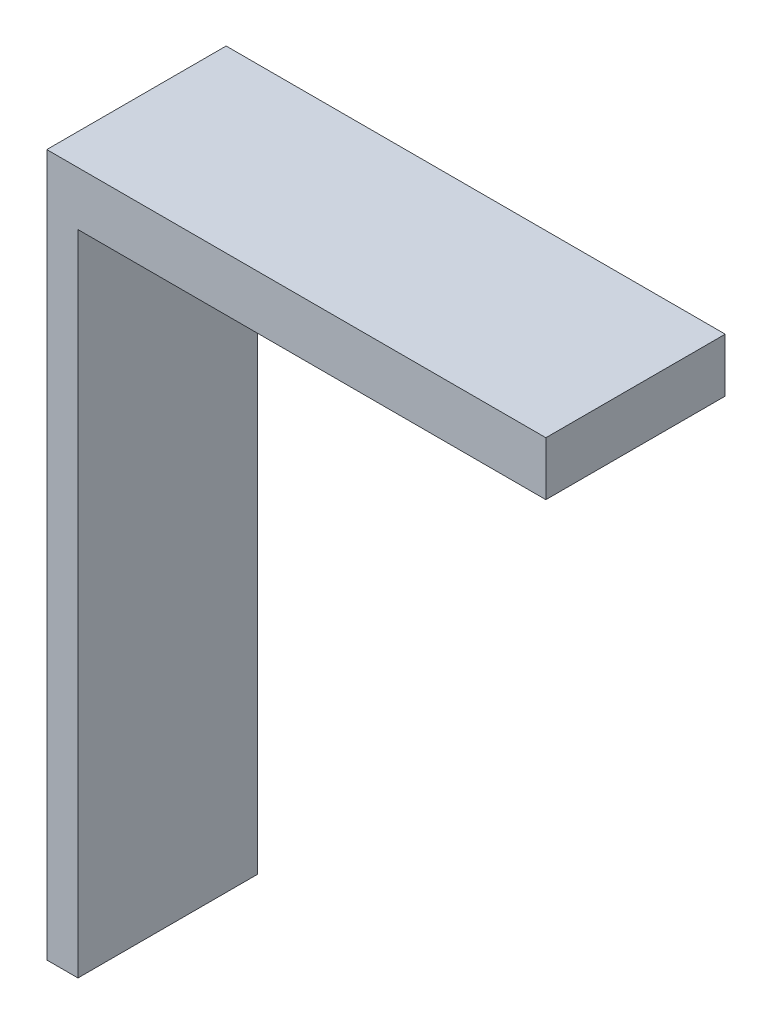
ISO-10303-21;
HEADER;
FILE_DESCRIPTION(('STEP AP214'),'2;1');
FILE_NAME('part.step','',(''),(''),'','','');
FILE_SCHEMA(('AUTOMOTIVE_DESIGN { 1 0 10303 214 1 1 1 1 }'));
ENDSEC;
DATA;
#1=APPLICATION_CONTEXT('core data for automotive mechanical design processes');
#2=APPLICATION_PROTOCOL_DEFINITION('international standard','automotive_design',2000,#1);
#3=PRODUCT_CONTEXT('',#1,'mechanical');
#4=PRODUCT('Part','Part','',(#3));
#5=PRODUCT_RELATED_PRODUCT_CATEGORY('part','',(#4));
#6=PRODUCT_DEFINITION_FORMATION('','',#4);
#7=PRODUCT_DEFINITION_CONTEXT('part definition',#1,'design');
#8=PRODUCT_DEFINITION('design','',#6,#7);
#9=PRODUCT_DEFINITION_SHAPE('','',#8);
#10=(LENGTH_UNIT() NAMED_UNIT(*) SI_UNIT(.MILLI.,.METRE.));
#11=(NAMED_UNIT(*) PLANE_ANGLE_UNIT() SI_UNIT($,.RADIAN.));
#12=(NAMED_UNIT(*) SI_UNIT($,.STERADIAN.) SOLID_ANGLE_UNIT());
#13=UNCERTAINTY_MEASURE_WITH_UNIT(LENGTH_MEASURE(1.E-05),#10,'distance_accuracy_value','');
#14=(GEOMETRIC_REPRESENTATION_CONTEXT(3) GLOBAL_UNCERTAINTY_ASSIGNED_CONTEXT((#13)) GLOBAL_UNIT_ASSIGNED_CONTEXT((#10,
#11,#12)) REPRESENTATION_CONTEXT('',''));
#15=CARTESIAN_POINT('',(0.,0.,0.));
#16=DIRECTION('',(0.,0.,1.));
#17=DIRECTION('',(1.,0.,0.));
#18=AXIS2_PLACEMENT_3D('',#15,#16,#17);
#19=CARTESIAN_POINT('',(2.,-45.,23.));
#20=DIRECTION('',(-1.,0.,0.));
#21=DIRECTION('',(0.,0.,1.));
#22=AXIS2_PLACEMENT_3D('',#19,#20,#21);
#23=PLANE('',#22);
#24=DIRECTION('',(0.,0.,-1.));
#25=VECTOR('',#24,1.);
#26=CARTESIAN_POINT('',(2.,38.1165491931324,23.));
#27=LINE('',#26,#25);
#28=CARTESIAN_POINT('',(2.,38.1165491931324,23.));
#29=VERTEX_POINT('',#28);
#30=CARTESIAN_POINT('',(2.,38.1165491931324,0.));
#31=VERTEX_POINT('',#30);
#32=EDGE_CURVE('E53',#29,#31,#27,.T.);
#33=ORIENTED_EDGE('',*,*,#32,.F.);
#34=DIRECTION('',(0.,1.,0.));
#35=VECTOR('',#34,1.);
#36=CARTESIAN_POINT('',(2.,-45.,23.));
#37=LINE('',#36,#35);
#38=CARTESIAN_POINT('',(2.,-45.,23.));
#39=VERTEX_POINT('',#38);
#40=EDGE_CURVE('E119',#39,#29,#37,.T.);
#41=ORIENTED_EDGE('',*,*,#40,.F.);
#42=DIRECTION('',(0.,0.,-1.));
#43=VECTOR('',#42,1.);
#44=CARTESIAN_POINT('',(2.,-45.,23.));
#45=LINE('',#44,#43);
#46=CARTESIAN_POINT('',(2.,-45.,0.));
#47=VERTEX_POINT('',#46);
#48=EDGE_CURVE('E131',#39,#47,#45,.T.);
#49=ORIENTED_EDGE('',*,*,#48,.T.);
#50=DIRECTION('',(0.,1.,0.));
#51=VECTOR('',#50,1.);
#52=CARTESIAN_POINT('',(2.,-45.,0.));
#53=LINE('',#52,#51);
#54=EDGE_CURVE('E120',#47,#31,#53,.T.);
#55=ORIENTED_EDGE('',*,*,#54,.T.);
#56=EDGE_LOOP('',(#33,#41,#49,#55));
#57=FACE_BOUND('',#56,.T.);
#58=ADVANCED_FACE('F39',(#57),#23,.F.);
#59=CARTESIAN_POINT('',(-2.,45.,23.));
#60=DIRECTION('',(0.,-1.,0.));
#61=DIRECTION('',(0.,0.,-1.));
#62=AXIS2_PLACEMENT_3D('',#59,#60,#61);
#63=PLANE('',#62);
#64=DIRECTION('',(-1.,0.,0.));
#65=VECTOR('',#64,1.);
#66=CARTESIAN_POINT('',(-2.,45.,0.));
#67=LINE('',#66,#65);
#68=CARTESIAN_POINT('',(62.,45.,0.));
#69=VERTEX_POINT('',#68);
#70=CARTESIAN_POINT('',(-2.,45.,0.));
#71=VERTEX_POINT('',#70);
#72=EDGE_CURVE('E122',#69,#71,#67,.T.);
#73=ORIENTED_EDGE('',*,*,#72,.T.);
#74=DIRECTION('',(0.,0.,-1.));
#75=VECTOR('',#74,1.);
#76=CARTESIAN_POINT('',(-2.,45.,23.));
#77=LINE('',#76,#75);
#78=CARTESIAN_POINT('',(-2.,45.,23.));
#79=VERTEX_POINT('',#78);
#80=EDGE_CURVE('E11',#79,#71,#77,.T.);
#81=ORIENTED_EDGE('',*,*,#80,.F.);
#82=DIRECTION('',(-1.,0.,0.));
#83=VECTOR('',#82,1.);
#84=CARTESIAN_POINT('',(-2.,45.,23.));
#85=LINE('',#84,#83);
#86=CARTESIAN_POINT('',(62.,45.,23.));
#87=VERTEX_POINT('',#86);
#88=EDGE_CURVE('E83',#87,#79,#85,.T.);
#89=ORIENTED_EDGE('',*,*,#88,.F.);
#90=DIRECTION('',(0.,0.,1.));
#91=VECTOR('',#90,1.);
#92=CARTESIAN_POINT('',(62.,45.,23.));
#93=LINE('',#92,#91);
#94=EDGE_CURVE('E116',#69,#87,#93,.T.);
#95=ORIENTED_EDGE('',*,*,#94,.F.);
#96=EDGE_LOOP('',(#73,#81,#89,#95));
#97=FACE_BOUND('',#96,.T.);
#98=ADVANCED_FACE('F148',(#97),#63,.F.);
#99=CARTESIAN_POINT('',(-2.,-45.,23.));
#100=DIRECTION('',(1.,0.,0.));
#101=DIRECTION('',(0.,0.,-1.));
#102=AXIS2_PLACEMENT_3D('',#99,#100,#101);
#103=PLANE('',#102);
#104=DIRECTION('',(0.,-1.,0.));
#105=VECTOR('',#104,1.);
#106=CARTESIAN_POINT('',(-2.,-45.,0.));
#107=LINE('',#106,#105);
#108=CARTESIAN_POINT('',(-2.,-45.,0.));
#109=VERTEX_POINT('',#108);
#110=EDGE_CURVE('E134',#71,#109,#107,.T.);
#111=ORIENTED_EDGE('',*,*,#110,.T.);
#112=DIRECTION('',(0.,0.,-1.));
#113=VECTOR('',#112,1.);
#114=CARTESIAN_POINT('',(-2.,-45.,23.));
#115=LINE('',#114,#113);
#116=CARTESIAN_POINT('',(-2.,-45.,23.));
#117=VERTEX_POINT('',#116);
#118=EDGE_CURVE('E46',#117,#109,#115,.T.);
#119=ORIENTED_EDGE('',*,*,#118,.F.);
#120=DIRECTION('',(0.,-1.,0.));
#121=VECTOR('',#120,1.);
#122=CARTESIAN_POINT('',(-2.,-45.,23.));
#123=LINE('',#122,#121);
#124=EDGE_CURVE('E129',#79,#117,#123,.T.);
#125=ORIENTED_EDGE('',*,*,#124,.F.);
#126=ORIENTED_EDGE('',*,*,#80,.T.);
#127=EDGE_LOOP('',(#111,#119,#125,#126));
#128=FACE_BOUND('',#127,.T.);
#129=ADVANCED_FACE('F149',(#128),#103,.F.);
#130=CARTESIAN_POINT('',(-2.,-45.,23.));
#131=DIRECTION('',(0.,1.,0.));
#132=DIRECTION('',(0.,0.,1.));
#133=AXIS2_PLACEMENT_3D('',#130,#131,#132);
#134=PLANE('',#133);
#135=DIRECTION('',(1.,0.,0.));
#136=VECTOR('',#135,1.);
#137=CARTESIAN_POINT('',(-2.,-45.,0.));
#138=LINE('',#137,#136);
#139=EDGE_CURVE('E78',#109,#47,#138,.T.);
#140=ORIENTED_EDGE('',*,*,#139,.T.);
#141=ORIENTED_EDGE('',*,*,#48,.F.);
#142=DIRECTION('',(1.,0.,0.));
#143=VECTOR('',#142,1.);
#144=CARTESIAN_POINT('',(-2.,-45.,23.));
#145=LINE('',#144,#143);
#146=EDGE_CURVE('E61',#117,#39,#145,.T.);
#147=ORIENTED_EDGE('',*,*,#146,.F.);
#148=ORIENTED_EDGE('',*,*,#118,.T.);
#149=EDGE_LOOP('',(#140,#141,#147,#148));
#150=FACE_BOUND('',#149,.T.);
#151=ADVANCED_FACE('F138',(#150),#134,.F.);
#152=CARTESIAN_POINT('',(0.,0.,23.));
#153=DIRECTION('',(0.,0.,-1.));
#154=DIRECTION('',(-1.,0.,0.));
#155=AXIS2_PLACEMENT_3D('',#152,#153,#154);
#156=PLANE('',#155);
#157=ORIENTED_EDGE('',*,*,#40,.T.);
#158=DIRECTION('',(-1.,0.,0.));
#159=VECTOR('',#158,1.);
#160=CARTESIAN_POINT('',(62.,38.1165491931324,23.));
#161=LINE('',#160,#159);
#162=CARTESIAN_POINT('',(62.,38.1165491931324,23.));
#163=VERTEX_POINT('',#162);
#164=EDGE_CURVE('E104',#163,#29,#161,.T.);
#165=ORIENTED_EDGE('',*,*,#164,.F.);
#166=DIRECTION('',(0.,-1.,0.));
#167=VECTOR('',#166,1.);
#168=CARTESIAN_POINT('',(62.,45.,23.));
#169=LINE('',#168,#167);
#170=EDGE_CURVE('E111',#87,#163,#169,.T.);
#171=ORIENTED_EDGE('',*,*,#170,.F.);
#172=ORIENTED_EDGE('',*,*,#88,.T.);
#173=ORIENTED_EDGE('',*,*,#124,.T.);
#174=ORIENTED_EDGE('',*,*,#146,.T.);
#175=EDGE_LOOP('',(#157,#165,#171,#172,#173,#174));
#176=FACE_BOUND('',#175,.T.);
#177=ADVANCED_FACE('F118',(#176),#156,.F.);
#178=CARTESIAN_POINT('',(0.,0.,0.));
#179=DIRECTION('',(0.,0.,-1.));
#180=DIRECTION('',(-1.,0.,0.));
#181=AXIS2_PLACEMENT_3D('',#178,#179,#180);
#182=PLANE('',#181);
#183=ORIENTED_EDGE('',*,*,#54,.F.);
#184=ORIENTED_EDGE('',*,*,#139,.F.);
#185=ORIENTED_EDGE('',*,*,#110,.F.);
#186=ORIENTED_EDGE('',*,*,#72,.F.);
#187=DIRECTION('',(0.,1.,0.));
#188=VECTOR('',#187,1.);
#189=CARTESIAN_POINT('',(62.,45.,0.));
#190=LINE('',#189,#188);
#191=CARTESIAN_POINT('',(62.,38.1165491931324,0.));
#192=VERTEX_POINT('',#191);
#193=EDGE_CURVE('E110',#192,#69,#190,.T.);
#194=ORIENTED_EDGE('',*,*,#193,.F.);
#195=DIRECTION('',(-1.,0.,0.));
#196=VECTOR('',#195,1.);
#197=CARTESIAN_POINT('',(62.,38.1165491931324,0.));
#198=LINE('',#197,#196);
#199=EDGE_CURVE('E106',#192,#31,#198,.T.);
#200=ORIENTED_EDGE('',*,*,#199,.T.);
#201=EDGE_LOOP('',(#183,#184,#185,#186,#194,#200));
#202=FACE_BOUND('',#201,.T.);
#203=ADVANCED_FACE('F144',(#202),#182,.T.);
#204=CARTESIAN_POINT('',(62.,38.1165491931324,23.));
#205=DIRECTION('',(0.,1.,0.));
#206=DIRECTION('',(0.,0.,1.));
#207=AXIS2_PLACEMENT_3D('',#204,#205,#206);
#208=PLANE('',#207);
#209=ORIENTED_EDGE('',*,*,#32,.T.);
#210=ORIENTED_EDGE('',*,*,#199,.F.);
#211=DIRECTION('',(0.,0.,-1.));
#212=VECTOR('',#211,1.);
#213=CARTESIAN_POINT('',(62.,38.1165491931324,23.));
#214=LINE('',#213,#212);
#215=EDGE_CURVE('E100',#163,#192,#214,.T.);
#216=ORIENTED_EDGE('',*,*,#215,.F.);
#217=ORIENTED_EDGE('',*,*,#164,.T.);
#218=EDGE_LOOP('',(#209,#210,#216,#217));
#219=FACE_BOUND('',#218,.T.);
#220=ADVANCED_FACE('F102',(#219),#208,.F.);
#221=CARTESIAN_POINT('',(62.,0.,0.));
#222=DIRECTION('',(1.,0.,0.));
#223=DIRECTION('',(0.,0.,-1.));
#224=AXIS2_PLACEMENT_3D('',#221,#222,#223);
#225=PLANE('',#224);
#226=ORIENTED_EDGE('',*,*,#170,.T.);
#227=ORIENTED_EDGE('',*,*,#215,.T.);
#228=ORIENTED_EDGE('',*,*,#193,.T.);
#229=ORIENTED_EDGE('',*,*,#94,.T.);
#230=EDGE_LOOP('',(#226,#227,#228,#229));
#231=FACE_BOUND('',#230,.T.);
#232=ADVANCED_FACE('F114',(#231),#225,.T.);
#233=CLOSED_SHELL('',(#58,#98,#129,#151,#177,#203,#220,#232));
#234=MANIFOLD_SOLID_BREP('B2',#233);
#235=ADVANCED_BREP_SHAPE_REPRESENTATION('',(#18,#234),#14);
#236=SHAPE_DEFINITION_REPRESENTATION(#9,#235);
ENDSEC;
END-ISO-10303-21;
